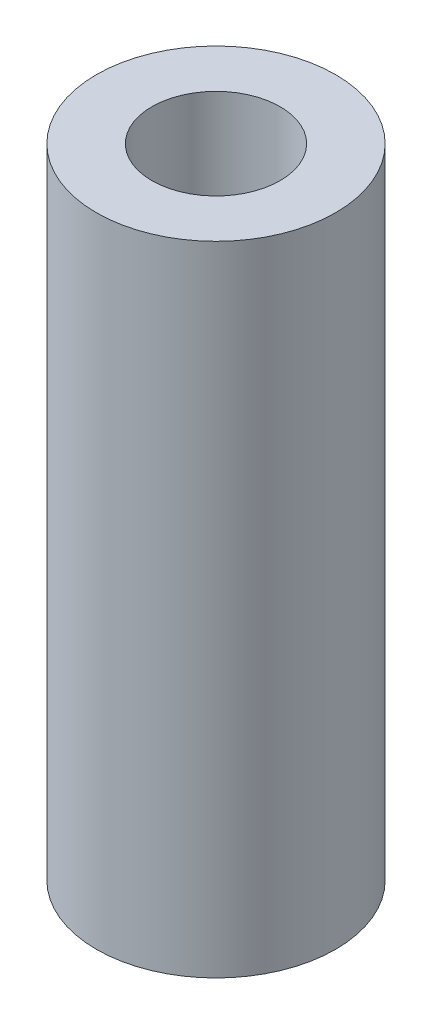
ISO-10303-21;
HEADER;
FILE_DESCRIPTION(('STEP AP214'),'2;1');
FILE_NAME('part.step','',(''),(''),'','','');
FILE_SCHEMA(('AUTOMOTIVE_DESIGN { 1 0 10303 214 1 1 1 1 }'));
ENDSEC;
DATA;
#1=APPLICATION_CONTEXT('core data for automotive mechanical design processes');
#2=APPLICATION_PROTOCOL_DEFINITION('international standard','automotive_design',2000,#1);
#3=PRODUCT_CONTEXT('',#1,'mechanical');
#4=PRODUCT('Part','Part','',(#3));
#5=PRODUCT_RELATED_PRODUCT_CATEGORY('part','',(#4));
#6=PRODUCT_DEFINITION_FORMATION('','',#4);
#7=PRODUCT_DEFINITION_CONTEXT('part definition',#1,'design');
#8=PRODUCT_DEFINITION('design','',#6,#7);
#9=PRODUCT_DEFINITION_SHAPE('','',#8);
#10=(LENGTH_UNIT() NAMED_UNIT(*) SI_UNIT(.MILLI.,.METRE.));
#11=(NAMED_UNIT(*) PLANE_ANGLE_UNIT() SI_UNIT($,.RADIAN.));
#12=(NAMED_UNIT(*) SI_UNIT($,.STERADIAN.) SOLID_ANGLE_UNIT());
#13=UNCERTAINTY_MEASURE_WITH_UNIT(LENGTH_MEASURE(1.E-05),#10,'distance_accuracy_value','');
#14=(GEOMETRIC_REPRESENTATION_CONTEXT(3) GLOBAL_UNCERTAINTY_ASSIGNED_CONTEXT((#13)) GLOBAL_UNIT_ASSIGNED_CONTEXT((#10,
#11,#12)) REPRESENTATION_CONTEXT('',''));
#15=CARTESIAN_POINT('',(0.,0.,0.));
#16=DIRECTION('',(0.,0.,1.));
#17=DIRECTION('',(1.,0.,0.));
#18=AXIS2_PLACEMENT_3D('',#15,#16,#17);
#19=CARTESIAN_POINT('',(0.,25.4,0.));
#20=DIRECTION('',(0.,1.,0.));
#21=DIRECTION('',(0.,0.,1.));
#22=AXIS2_PLACEMENT_3D('',#19,#20,#21);
#23=PLANE('',#22);
#24=CARTESIAN_POINT('',(0.,25.4,0.));
#25=DIRECTION('',(0.,1.,0.));
#26=DIRECTION('',(0.,0.,1.));
#27=AXIS2_PLACEMENT_3D('',#24,#25,#26);
#28=CIRCLE('',#27,4.7625);
#29=CARTESIAN_POINT('',(0.,25.4,4.7625));
#30=VERTEX_POINT('',#29);
#31=EDGE_CURVE('E10',#30,#30,#28,.T.);
#32=ORIENTED_EDGE('',*,*,#31,.T.);
#33=EDGE_LOOP('',(#32));
#34=FACE_BOUND('',#33,.T.);
#35=CARTESIAN_POINT('',(0.,25.4,0.));
#36=DIRECTION('',(0.,1.,0.));
#37=DIRECTION('',(0.,0.,1.));
#38=AXIS2_PLACEMENT_3D('',#35,#36,#37);
#39=CIRCLE('',#38,2.5527);
#40=CARTESIAN_POINT('',(0.,25.4,2.5527));
#41=VERTEX_POINT('',#40);
#42=EDGE_CURVE('E48',#41,#41,#39,.T.);
#43=ORIENTED_EDGE('',*,*,#42,.F.);
#44=EDGE_LOOP('',(#43));
#45=FACE_BOUND('',#44,.T.);
#46=ADVANCED_FACE('F37',(#34,#45),#23,.T.);
#47=CARTESIAN_POINT('',(0.,0.,0.));
#48=DIRECTION('',(0.,1.,0.));
#49=DIRECTION('',(0.,0.,1.));
#50=AXIS2_PLACEMENT_3D('',#47,#48,#49);
#51=PLANE('',#50);
#52=CARTESIAN_POINT('',(0.,0.,0.));
#53=DIRECTION('',(0.,1.,0.));
#54=DIRECTION('',(0.,0.,1.));
#55=AXIS2_PLACEMENT_3D('',#52,#53,#54);
#56=CIRCLE('',#55,4.7625);
#57=CARTESIAN_POINT('',(0.,0.,4.7625));
#58=VERTEX_POINT('',#57);
#59=EDGE_CURVE('E41',#58,#58,#56,.T.);
#60=ORIENTED_EDGE('',*,*,#59,.F.);
#61=EDGE_LOOP('',(#60));
#62=FACE_BOUND('',#61,.T.);
#63=CARTESIAN_POINT('',(0.,0.,0.));
#64=DIRECTION('',(0.,1.,0.));
#65=DIRECTION('',(0.,0.,1.));
#66=AXIS2_PLACEMENT_3D('',#63,#64,#65);
#67=CIRCLE('',#66,2.5527);
#68=CARTESIAN_POINT('',(0.,0.,2.5527));
#69=VERTEX_POINT('',#68);
#70=EDGE_CURVE('E50',#69,#69,#67,.T.);
#71=ORIENTED_EDGE('',*,*,#70,.T.);
#72=EDGE_LOOP('',(#71));
#73=FACE_BOUND('',#72,.T.);
#74=ADVANCED_FACE('F60',(#62,#73),#51,.F.);
#75=CARTESIAN_POINT('',(0.,25.4,0.));
#76=DIRECTION('',(0.,-1.,0.));
#77=DIRECTION('',(0.,0.,-1.));
#78=AXIS2_PLACEMENT_3D('',#75,#76,#77);
#79=CYLINDRICAL_SURFACE('',#78,4.7625);
#80=ORIENTED_EDGE('',*,*,#31,.F.);
#81=EDGE_LOOP('',(#80));
#82=FACE_BOUND('',#81,.T.);
#83=ORIENTED_EDGE('',*,*,#59,.T.);
#84=EDGE_LOOP('',(#83));
#85=FACE_BOUND('',#84,.T.);
#86=ADVANCED_FACE('F39',(#82,#85),#79,.T.);
#87=CARTESIAN_POINT('',(0.,25.4,0.));
#88=DIRECTION('',(0.,-1.,0.));
#89=DIRECTION('',(0.,0.,-1.));
#90=AXIS2_PLACEMENT_3D('',#87,#88,#89);
#91=CYLINDRICAL_SURFACE('',#90,2.5527);
#92=ORIENTED_EDGE('',*,*,#42,.T.);
#93=EDGE_LOOP('',(#92));
#94=FACE_BOUND('',#93,.T.);
#95=ORIENTED_EDGE('',*,*,#70,.F.);
#96=EDGE_LOOP('',(#95));
#97=FACE_BOUND('',#96,.T.);
#98=ADVANCED_FACE('F56',(#94,#97),#91,.F.);
#99=CLOSED_SHELL('',(#46,#74,#86,#98));
#100=MANIFOLD_SOLID_BREP('B2',#99);
#101=ADVANCED_BREP_SHAPE_REPRESENTATION('',(#18,#100),#14);
#102=SHAPE_DEFINITION_REPRESENTATION(#9,#101);
ENDSEC;
END-ISO-10303-21;
